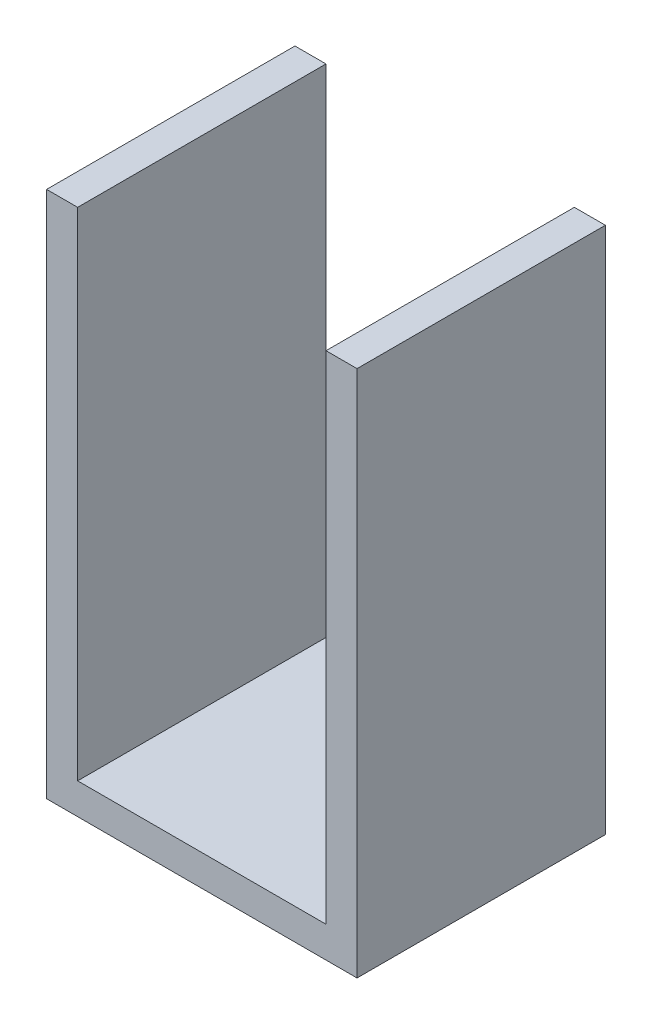
ISO-10303-21;
HEADER;
FILE_DESCRIPTION(('STEP AP214'),'2;1');
FILE_NAME('part.step','',(''),(''),'','','');
FILE_SCHEMA(('AUTOMOTIVE_DESIGN { 1 0 10303 214 1 1 1 1 }'));
ENDSEC;
DATA;
#1=APPLICATION_CONTEXT('core data for automotive mechanical design processes');
#2=APPLICATION_PROTOCOL_DEFINITION('international standard','automotive_design',2000,#1);
#3=PRODUCT_CONTEXT('',#1,'mechanical');
#4=PRODUCT('Part','Part','',(#3));
#5=PRODUCT_RELATED_PRODUCT_CATEGORY('part','',(#4));
#6=PRODUCT_DEFINITION_FORMATION('','',#4);
#7=PRODUCT_DEFINITION_CONTEXT('part definition',#1,'design');
#8=PRODUCT_DEFINITION('design','',#6,#7);
#9=PRODUCT_DEFINITION_SHAPE('','',#8);
#10=(LENGTH_UNIT() NAMED_UNIT(*) SI_UNIT(.MILLI.,.METRE.));
#11=(NAMED_UNIT(*) PLANE_ANGLE_UNIT() SI_UNIT($,.RADIAN.));
#12=(NAMED_UNIT(*) SI_UNIT($,.STERADIAN.) SOLID_ANGLE_UNIT());
#13=UNCERTAINTY_MEASURE_WITH_UNIT(LENGTH_MEASURE(1.E-05),#10,'distance_accuracy_value','');
#14=(GEOMETRIC_REPRESENTATION_CONTEXT(3) GLOBAL_UNCERTAINTY_ASSIGNED_CONTEXT((#13)) GLOBAL_UNIT_ASSIGNED_CONTEXT((#10,
#11,#12)) REPRESENTATION_CONTEXT('',''));
#15=CARTESIAN_POINT('',(0.,0.,0.));
#16=DIRECTION('',(0.,0.,1.));
#17=DIRECTION('',(1.,0.,0.));
#18=AXIS2_PLACEMENT_3D('',#15,#16,#17);
#19=CARTESIAN_POINT('',(0.,5.,0.));
#20=DIRECTION('',(0.,-1.,0.));
#21=DIRECTION('',(0.,0.,-1.));
#22=AXIS2_PLACEMENT_3D('',#19,#20,#21);
#23=PLANE('',#22);
#24=DIRECTION('',(0.,0.,1.));
#25=VECTOR('',#24,1.);
#26=CARTESIAN_POINT('',(25.,5.,-20.));
#27=LINE('',#26,#25);
#28=CARTESIAN_POINT('',(25.,5.,-20.));
#29=VERTEX_POINT('',#28);
#30=CARTESIAN_POINT('',(25.,5.,20.));
#31=VERTEX_POINT('',#30);
#32=EDGE_CURVE('E134',#29,#31,#27,.T.);
#33=ORIENTED_EDGE('',*,*,#32,.F.);
#34=DIRECTION('',(-1.,0.,0.));
#35=VECTOR('',#34,1.);
#36=CARTESIAN_POINT('',(-20.,5.,-20.));
#37=LINE('',#36,#35);
#38=CARTESIAN_POINT('',(-15.,5.,-20.));
#39=VERTEX_POINT('',#38);
#40=EDGE_CURVE('E177',#29,#39,#37,.T.);
#41=ORIENTED_EDGE('',*,*,#40,.T.);
#42=DIRECTION('',(0.,0.,-1.));
#43=VECTOR('',#42,1.);
#44=CARTESIAN_POINT('',(-15.,5.,-20.));
#45=LINE('',#44,#43);
#46=CARTESIAN_POINT('',(-15.,5.,20.));
#47=VERTEX_POINT('',#46);
#48=EDGE_CURVE('E55',#47,#39,#45,.T.);
#49=ORIENTED_EDGE('',*,*,#48,.F.);
#50=DIRECTION('',(1.,0.,0.));
#51=VECTOR('',#50,1.);
#52=CARTESIAN_POINT('',(-20.,5.,20.));
#53=LINE('',#52,#51);
#54=EDGE_CURVE('E180',#47,#31,#53,.T.);
#55=ORIENTED_EDGE('',*,*,#54,.T.);
#56=EDGE_LOOP('',(#33,#41,#49,#55));
#57=FACE_BOUND('',#56,.T.);
#58=ADVANCED_FACE('F39',(#57),#23,.F.);
#59=CARTESIAN_POINT('',(-20.,5.,-20.));
#60=DIRECTION('',(0.,0.,1.));
#61=DIRECTION('',(1.,0.,0.));
#62=AXIS2_PLACEMENT_3D('',#59,#60,#61);
#63=PLANE('',#62);
#64=DIRECTION('',(-1.,0.,0.));
#65=VECTOR('',#64,1.);
#66=CARTESIAN_POINT('',(-20.,0.,-20.));
#67=LINE('',#66,#65);
#68=CARTESIAN_POINT('',(30.,0.,-20.));
#69=VERTEX_POINT('',#68);
#70=CARTESIAN_POINT('',(-20.,0.,-20.));
#71=VERTEX_POINT('',#70);
#72=EDGE_CURVE('E176',#69,#71,#67,.T.);
#73=ORIENTED_EDGE('',*,*,#72,.T.);
#74=DIRECTION('',(0.,-1.,0.));
#75=VECTOR('',#74,1.);
#76=CARTESIAN_POINT('',(-20.,5.,-20.));
#77=LINE('',#76,#75);
#78=CARTESIAN_POINT('',(-20.,85.,-20.));
#79=VERTEX_POINT('',#78);
#80=EDGE_CURVE('E11',#79,#71,#77,.T.);
#81=ORIENTED_EDGE('',*,*,#80,.F.);
#82=DIRECTION('',(-1.,0.,0.));
#83=VECTOR('',#82,1.);
#84=CARTESIAN_POINT('',(-20.,85.,-20.));
#85=LINE('',#84,#83);
#86=CARTESIAN_POINT('',(-15.,85.,-20.));
#87=VERTEX_POINT('',#86);
#88=EDGE_CURVE('E159',#87,#79,#85,.T.);
#89=ORIENTED_EDGE('',*,*,#88,.F.);
#90=DIRECTION('',(0.,-1.,0.));
#91=VECTOR('',#90,1.);
#92=CARTESIAN_POINT('',(-15.,85.,-20.));
#93=LINE('',#92,#91);
#94=EDGE_CURVE('E163',#87,#39,#93,.T.);
#95=ORIENTED_EDGE('',*,*,#94,.T.);
#96=ORIENTED_EDGE('',*,*,#40,.F.);
#97=DIRECTION('',(0.,-1.,0.));
#98=VECTOR('',#97,1.);
#99=CARTESIAN_POINT('',(25.,85.,-20.));
#100=LINE('',#99,#98);
#101=CARTESIAN_POINT('',(25.,85.,-20.));
#102=VERTEX_POINT('',#101);
#103=EDGE_CURVE('E123',#102,#29,#100,.T.);
#104=ORIENTED_EDGE('',*,*,#103,.F.);
#105=DIRECTION('',(-1.,0.,0.));
#106=VECTOR('',#105,1.);
#107=CARTESIAN_POINT('',(30.,85.,-20.));
#108=LINE('',#107,#106);
#109=CARTESIAN_POINT('',(30.,85.,-20.));
#110=VERTEX_POINT('',#109);
#111=EDGE_CURVE('E121',#110,#102,#108,.T.);
#112=ORIENTED_EDGE('',*,*,#111,.F.);
#113=DIRECTION('',(0.,1.,0.));
#114=VECTOR('',#113,1.);
#115=CARTESIAN_POINT('',(30.,5.,-20.));
#116=LINE('',#115,#114);
#117=EDGE_CURVE('E107',#69,#110,#116,.T.);
#118=ORIENTED_EDGE('',*,*,#117,.F.);
#119=EDGE_LOOP('',(#73,#81,#89,#95,#96,#104,#112,#118));
#120=FACE_BOUND('',#119,.T.);
#121=ADVANCED_FACE('F41',(#120),#63,.F.);
#122=CARTESIAN_POINT('',(-20.,5.,20.));
#123=DIRECTION('',(1.,0.,0.));
#124=DIRECTION('',(0.,0.,-1.));
#125=AXIS2_PLACEMENT_3D('',#122,#123,#124);
#126=PLANE('',#125);
#127=DIRECTION('',(0.,0.,1.));
#128=VECTOR('',#127,1.);
#129=CARTESIAN_POINT('',(-20.,0.,20.));
#130=LINE('',#129,#128);
#131=CARTESIAN_POINT('',(-20.,0.,20.));
#132=VERTEX_POINT('',#131);
#133=EDGE_CURVE('E62',#71,#132,#130,.T.);
#134=ORIENTED_EDGE('',*,*,#133,.T.);
#135=DIRECTION('',(0.,-1.,0.));
#136=VECTOR('',#135,1.);
#137=CARTESIAN_POINT('',(-20.,5.,20.));
#138=LINE('',#137,#136);
#139=CARTESIAN_POINT('',(-20.,85.,20.));
#140=VERTEX_POINT('',#139);
#141=EDGE_CURVE('E48',#140,#132,#138,.T.);
#142=ORIENTED_EDGE('',*,*,#141,.F.);
#143=DIRECTION('',(0.,0.,1.));
#144=VECTOR('',#143,1.);
#145=CARTESIAN_POINT('',(-20.,85.,-20.));
#146=LINE('',#145,#144);
#147=EDGE_CURVE('E149',#79,#140,#146,.T.);
#148=ORIENTED_EDGE('',*,*,#147,.F.);
#149=ORIENTED_EDGE('',*,*,#80,.T.);
#150=EDGE_LOOP('',(#134,#142,#148,#149));
#151=FACE_BOUND('',#150,.T.);
#152=ADVANCED_FACE('F199',(#151),#126,.F.);
#153=CARTESIAN_POINT('',(-20.,5.,20.));
#154=DIRECTION('',(0.,0.,-1.));
#155=DIRECTION('',(-1.,0.,0.));
#156=AXIS2_PLACEMENT_3D('',#153,#154,#155);
#157=PLANE('',#156);
#158=DIRECTION('',(1.,0.,0.));
#159=VECTOR('',#158,1.);
#160=CARTESIAN_POINT('',(-20.,0.,20.));
#161=LINE('',#160,#159);
#162=CARTESIAN_POINT('',(30.,0.,20.));
#163=VERTEX_POINT('',#162);
#164=EDGE_CURVE('E181',#132,#163,#161,.T.);
#165=ORIENTED_EDGE('',*,*,#164,.T.);
#166=DIRECTION('',(0.,-1.,0.));
#167=VECTOR('',#166,1.);
#168=CARTESIAN_POINT('',(30.,5.,20.));
#169=LINE('',#168,#167);
#170=CARTESIAN_POINT('',(30.,85.,20.));
#171=VERTEX_POINT('',#170);
#172=EDGE_CURVE('E117',#171,#163,#169,.T.);
#173=ORIENTED_EDGE('',*,*,#172,.F.);
#174=DIRECTION('',(1.,0.,0.));
#175=VECTOR('',#174,1.);
#176=CARTESIAN_POINT('',(30.,85.,20.));
#177=LINE('',#176,#175);
#178=CARTESIAN_POINT('',(25.,85.,20.));
#179=VERTEX_POINT('',#178);
#180=EDGE_CURVE('E132',#179,#171,#177,.T.);
#181=ORIENTED_EDGE('',*,*,#180,.F.);
#182=DIRECTION('',(0.,-1.,0.));
#183=VECTOR('',#182,1.);
#184=CARTESIAN_POINT('',(25.,85.,20.));
#185=LINE('',#184,#183);
#186=EDGE_CURVE('E142',#179,#31,#185,.T.);
#187=ORIENTED_EDGE('',*,*,#186,.T.);
#188=ORIENTED_EDGE('',*,*,#54,.F.);
#189=DIRECTION('',(0.,-1.,0.));
#190=VECTOR('',#189,1.);
#191=CARTESIAN_POINT('',(-15.,85.,20.));
#192=LINE('',#191,#190);
#193=CARTESIAN_POINT('',(-15.,85.,20.));
#194=VERTEX_POINT('',#193);
#195=EDGE_CURVE('E118',#194,#47,#192,.T.);
#196=ORIENTED_EDGE('',*,*,#195,.F.);
#197=DIRECTION('',(1.,0.,0.));
#198=VECTOR('',#197,1.);
#199=CARTESIAN_POINT('',(-20.,85.,20.));
#200=LINE('',#199,#198);
#201=EDGE_CURVE('E153',#140,#194,#200,.T.);
#202=ORIENTED_EDGE('',*,*,#201,.F.);
#203=ORIENTED_EDGE('',*,*,#141,.T.);
#204=EDGE_LOOP('',(#165,#173,#181,#187,#188,#196,#202,#203));
#205=FACE_BOUND('',#204,.T.);
#206=ADVANCED_FACE('F193',(#205),#157,.F.);
#207=CARTESIAN_POINT('',(0.,0.,0.));
#208=DIRECTION('',(0.,-1.,0.));
#209=DIRECTION('',(0.,0.,-1.));
#210=AXIS2_PLACEMENT_3D('',#207,#208,#209);
#211=PLANE('',#210);
#212=ORIENTED_EDGE('',*,*,#72,.F.);
#213=DIRECTION('',(0.,0.,-1.));
#214=VECTOR('',#213,1.);
#215=CARTESIAN_POINT('',(30.,0.,-20.));
#216=LINE('',#215,#214);
#217=EDGE_CURVE('E114',#163,#69,#216,.T.);
#218=ORIENTED_EDGE('',*,*,#217,.F.);
#219=ORIENTED_EDGE('',*,*,#164,.F.);
#220=ORIENTED_EDGE('',*,*,#133,.F.);
#221=EDGE_LOOP('',(#212,#218,#219,#220));
#222=FACE_BOUND('',#221,.T.);
#223=ADVANCED_FACE('F197',(#222),#211,.T.);
#224=CARTESIAN_POINT('',(30.,0.,0.));
#225=DIRECTION('',(-1.,0.,0.));
#226=DIRECTION('',(0.,0.,1.));
#227=AXIS2_PLACEMENT_3D('',#224,#225,#226);
#228=PLANE('',#227);
#229=ORIENTED_EDGE('',*,*,#117,.T.);
#230=DIRECTION('',(0.,0.,-1.));
#231=VECTOR('',#230,1.);
#232=CARTESIAN_POINT('',(30.,85.,-20.));
#233=LINE('',#232,#231);
#234=EDGE_CURVE('E112',#171,#110,#233,.T.);
#235=ORIENTED_EDGE('',*,*,#234,.F.);
#236=ORIENTED_EDGE('',*,*,#172,.T.);
#237=ORIENTED_EDGE('',*,*,#217,.T.);
#238=EDGE_LOOP('',(#229,#235,#236,#237));
#239=FACE_BOUND('',#238,.T.);
#240=ADVANCED_FACE('F109',(#239),#228,.F.);
#241=CARTESIAN_POINT('',(-15.,85.,-20.));
#242=DIRECTION('',(-1.,0.,0.));
#243=DIRECTION('',(0.,0.,1.));
#244=AXIS2_PLACEMENT_3D('',#241,#242,#243);
#245=PLANE('',#244);
#246=ORIENTED_EDGE('',*,*,#48,.T.);
#247=ORIENTED_EDGE('',*,*,#94,.F.);
#248=DIRECTION('',(0.,0.,-1.));
#249=VECTOR('',#248,1.);
#250=CARTESIAN_POINT('',(-15.,85.,-20.));
#251=LINE('',#250,#249);
#252=EDGE_CURVE('E156',#194,#87,#251,.T.);
#253=ORIENTED_EDGE('',*,*,#252,.F.);
#254=ORIENTED_EDGE('',*,*,#195,.T.);
#255=EDGE_LOOP('',(#246,#247,#253,#254));
#256=FACE_BOUND('',#255,.T.);
#257=ADVANCED_FACE('F205',(#256),#245,.F.);
#258=CARTESIAN_POINT('',(0.,85.,0.));
#259=DIRECTION('',(0.,1.,0.));
#260=DIRECTION('',(0.,0.,1.));
#261=AXIS2_PLACEMENT_3D('',#258,#259,#260);
#262=PLANE('',#261);
#263=ORIENTED_EDGE('',*,*,#147,.T.);
#264=ORIENTED_EDGE('',*,*,#201,.T.);
#265=ORIENTED_EDGE('',*,*,#252,.T.);
#266=ORIENTED_EDGE('',*,*,#88,.T.);
#267=EDGE_LOOP('',(#263,#264,#265,#266));
#268=FACE_BOUND('',#267,.T.);
#269=ADVANCED_FACE('F201',(#268),#262,.T.);
#270=CARTESIAN_POINT('',(25.,85.,-20.));
#271=DIRECTION('',(1.,0.,0.));
#272=DIRECTION('',(0.,0.,-1.));
#273=AXIS2_PLACEMENT_3D('',#270,#271,#272);
#274=PLANE('',#273);
#275=ORIENTED_EDGE('',*,*,#32,.T.);
#276=ORIENTED_EDGE('',*,*,#186,.F.);
#277=DIRECTION('',(0.,0.,1.));
#278=VECTOR('',#277,1.);
#279=CARTESIAN_POINT('',(25.,85.,-20.));
#280=LINE('',#279,#278);
#281=EDGE_CURVE('E127',#102,#179,#280,.T.);
#282=ORIENTED_EDGE('',*,*,#281,.F.);
#283=ORIENTED_EDGE('',*,*,#103,.T.);
#284=EDGE_LOOP('',(#275,#276,#282,#283));
#285=FACE_BOUND('',#284,.T.);
#286=ADVANCED_FACE('F209',(#285),#274,.F.);
#287=CARTESIAN_POINT('',(0.,85.,0.));
#288=DIRECTION('',(0.,-1.,0.));
#289=DIRECTION('',(0.,0.,-1.));
#290=AXIS2_PLACEMENT_3D('',#287,#288,#289);
#291=PLANE('',#290);
#292=ORIENTED_EDGE('',*,*,#234,.T.);
#293=ORIENTED_EDGE('',*,*,#111,.T.);
#294=ORIENTED_EDGE('',*,*,#281,.T.);
#295=ORIENTED_EDGE('',*,*,#180,.T.);
#296=EDGE_LOOP('',(#292,#293,#294,#295));
#297=FACE_BOUND('',#296,.T.);
#298=ADVANCED_FACE('F130',(#297),#291,.F.);
#299=CLOSED_SHELL('',(#58,#121,#152,#206,#223,#240,#257,#269,#286,#298));
#300=MANIFOLD_SOLID_BREP('B2',#299);
#301=ADVANCED_BREP_SHAPE_REPRESENTATION('',(#18,#300),#14);
#302=SHAPE_DEFINITION_REPRESENTATION(#9,#301);
ENDSEC;
END-ISO-10303-21;
